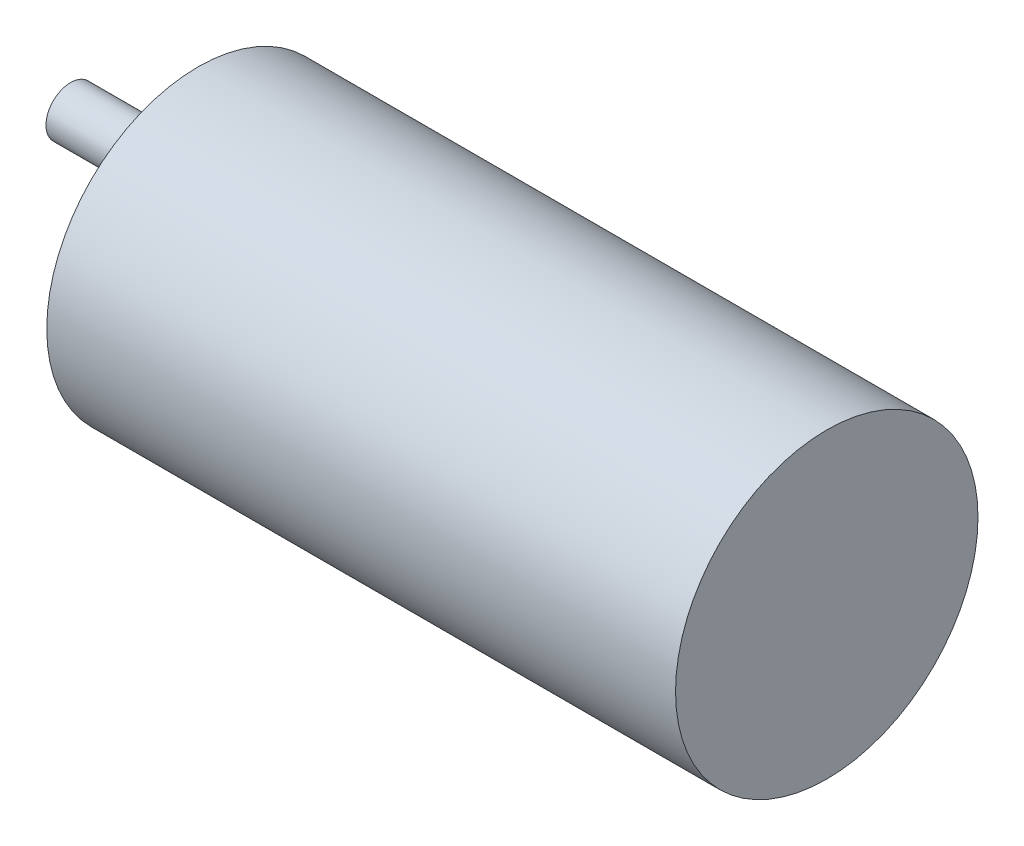
ISO-10303-21;
HEADER;
FILE_DESCRIPTION(('STEP AP214'),'2;1');
FILE_NAME('part.step','',(''),(''),'','','');
FILE_SCHEMA(('AUTOMOTIVE_DESIGN { 1 0 10303 214 1 1 1 1 }'));
ENDSEC;
DATA;
#1=APPLICATION_CONTEXT('core data for automotive mechanical design processes');
#2=APPLICATION_PROTOCOL_DEFINITION('international standard','automotive_design',2000,#1);
#3=PRODUCT_CONTEXT('',#1,'mechanical');
#4=PRODUCT('Part','Part','',(#3));
#5=PRODUCT_RELATED_PRODUCT_CATEGORY('part','',(#4));
#6=PRODUCT_DEFINITION_FORMATION('','',#4);
#7=PRODUCT_DEFINITION_CONTEXT('part definition',#1,'design');
#8=PRODUCT_DEFINITION('design','',#6,#7);
#9=PRODUCT_DEFINITION_SHAPE('','',#8);
#10=(LENGTH_UNIT() NAMED_UNIT(*) SI_UNIT(.MILLI.,.METRE.));
#11=(NAMED_UNIT(*) PLANE_ANGLE_UNIT() SI_UNIT($,.RADIAN.));
#12=(NAMED_UNIT(*) SI_UNIT($,.STERADIAN.) SOLID_ANGLE_UNIT());
#13=UNCERTAINTY_MEASURE_WITH_UNIT(LENGTH_MEASURE(1.E-05),#10,'distance_accuracy_value','');
#14=(GEOMETRIC_REPRESENTATION_CONTEXT(3) GLOBAL_UNCERTAINTY_ASSIGNED_CONTEXT((#13)) GLOBAL_UNIT_ASSIGNED_CONTEXT((#10,
#11,#12)) REPRESENTATION_CONTEXT('',''));
#15=CARTESIAN_POINT('',(0.,0.,0.));
#16=DIRECTION('',(0.,0.,1.));
#17=DIRECTION('',(1.,0.,0.));
#18=AXIS2_PLACEMENT_3D('',#15,#16,#17);
#19=CARTESIAN_POINT('',(-21.5,0.,-6.));
#20=DIRECTION('',(1.,0.,0.));
#21=DIRECTION('',(0.,0.,-1.));
#22=AXIS2_PLACEMENT_3D('',#19,#20,#21);
#23=PLANE('',#22);
#24=CARTESIAN_POINT('',(-21.5,0.,-6.));
#25=DIRECTION('',(1.,0.,0.));
#26=DIRECTION('',(0.,0.,-1.));
#27=AXIS2_PLACEMENT_3D('',#24,#25,#26);
#28=CIRCLE('',#27,3.);
#29=CARTESIAN_POINT('',(-21.5,0.,-9.));
#30=VERTEX_POINT('',#29);
#31=EDGE_CURVE('E41',#30,#30,#28,.T.);
#32=ORIENTED_EDGE('',*,*,#31,.F.);
#33=EDGE_LOOP('',(#32));
#34=FACE_BOUND('',#33,.T.);
#35=ADVANCED_FACE('F15',(#34),#23,.F.);
#36=CARTESIAN_POINT('',(-6.,0.,0.));
#37=DIRECTION('',(1.,0.,0.));
#38=DIRECTION('',(0.,0.,-1.));
#39=AXIS2_PLACEMENT_3D('',#36,#37,#38);
#40=PLANE('',#39);
#41=CARTESIAN_POINT('',(-6.,0.,-6.));
#42=DIRECTION('',(1.,0.,0.));
#43=DIRECTION('',(0.,0.,-1.));
#44=AXIS2_PLACEMENT_3D('',#41,#42,#43);
#45=CIRCLE('',#44,3.);
#46=CARTESIAN_POINT('',(-6.,0.,-9.));
#47=VERTEX_POINT('',#46);
#48=EDGE_CURVE('E38',#47,#47,#45,.T.);
#49=ORIENTED_EDGE('',*,*,#48,.T.);
#50=EDGE_LOOP('',(#49));
#51=FACE_BOUND('',#50,.T.);
#52=CARTESIAN_POINT('',(-6.,0.,-6.));
#53=DIRECTION('',(1.,0.,0.));
#54=DIRECTION('',(0.,0.,-1.));
#55=AXIS2_PLACEMENT_3D('',#52,#53,#54);
#56=CIRCLE('',#55,6.);
#57=CARTESIAN_POINT('',(-6.,0.,-12.));
#58=VERTEX_POINT('',#57);
#59=EDGE_CURVE('E34',#58,#58,#56,.T.);
#60=ORIENTED_EDGE('',*,*,#59,.F.);
#61=EDGE_LOOP('',(#60));
#62=FACE_BOUND('',#61,.T.);
#63=ADVANCED_FACE('F17',(#51,#62),#40,.F.);
#64=CARTESIAN_POINT('',(76.5,0.,18.4));
#65=DIRECTION('',(1.,0.,0.));
#66=DIRECTION('',(0.,1.,0.));
#67=AXIS2_PLACEMENT_3D('',#64,#65,#66);
#68=PLANE('',#67);
#69=CARTESIAN_POINT('',(76.5,0.,0.));
#70=DIRECTION('',(-1.,0.,0.));
#71=DIRECTION('',(0.,0.,1.));
#72=AXIS2_PLACEMENT_3D('',#69,#70,#71);
#73=CIRCLE('',#72,18.4);
#74=CARTESIAN_POINT('',(76.5,0.,18.4));
#75=VERTEX_POINT('',#74);
#76=EDGE_CURVE('E24',#75,#75,#73,.T.);
#77=ORIENTED_EDGE('',*,*,#76,.F.);
#78=EDGE_LOOP('',(#77));
#79=FACE_BOUND('',#78,.T.);
#80=ADVANCED_FACE('F53',(#79),#68,.T.);
#81=CARTESIAN_POINT('',(0.,0.,0.));
#82=DIRECTION('',(-1.,0.,0.));
#83=DIRECTION('',(0.,0.,1.));
#84=AXIS2_PLACEMENT_3D('',#81,#82,#83);
#85=PLANE('',#84);
#86=CARTESIAN_POINT('',(0.,0.,-6.));
#87=DIRECTION('',(1.,0.,0.));
#88=DIRECTION('',(0.,0.,-1.));
#89=AXIS2_PLACEMENT_3D('',#86,#87,#88);
#90=CIRCLE('',#89,6.);
#91=CARTESIAN_POINT('',(0.,0.,-12.));
#92=VERTEX_POINT('',#91);
#93=EDGE_CURVE('E19',#92,#92,#90,.T.);
#94=ORIENTED_EDGE('',*,*,#93,.T.);
#95=EDGE_LOOP('',(#94));
#96=FACE_BOUND('',#95,.T.);
#97=CARTESIAN_POINT('',(0.,0.,0.));
#98=DIRECTION('',(-1.,0.,0.));
#99=DIRECTION('',(0.,0.,1.));
#100=AXIS2_PLACEMENT_3D('',#97,#98,#99);
#101=CIRCLE('',#100,18.4);
#102=CARTESIAN_POINT('',(0.,0.,18.4));
#103=VERTEX_POINT('',#102);
#104=EDGE_CURVE('E10',#103,#103,#101,.T.);
#105=ORIENTED_EDGE('',*,*,#104,.T.);
#106=EDGE_LOOP('',(#105));
#107=FACE_BOUND('',#106,.T.);
#108=ADVANCED_FACE('F58',(#96,#107),#85,.T.);
#109=CARTESIAN_POINT('',(0.,0.,0.));
#110=DIRECTION('',(-1.,0.,0.));
#111=DIRECTION('',(0.,0.,1.));
#112=AXIS2_PLACEMENT_3D('',#109,#110,#111);
#113=CYLINDRICAL_SURFACE('',#112,18.4);
#114=ORIENTED_EDGE('',*,*,#104,.F.);
#115=EDGE_LOOP('',(#114));
#116=FACE_BOUND('',#115,.T.);
#117=ORIENTED_EDGE('',*,*,#76,.T.);
#118=EDGE_LOOP('',(#117));
#119=FACE_BOUND('',#118,.T.);
#120=ADVANCED_FACE('F62',(#116,#119),#113,.T.);
#121=CARTESIAN_POINT('',(-9.5,0.,-6.));
#122=DIRECTION('',(1.,0.,0.));
#123=DIRECTION('',(0.,0.,-1.));
#124=AXIS2_PLACEMENT_3D('',#121,#122,#123);
#125=CYLINDRICAL_SURFACE('',#124,6.);
#126=ORIENTED_EDGE('',*,*,#93,.F.);
#127=EDGE_LOOP('',(#126));
#128=FACE_BOUND('',#127,.T.);
#129=ORIENTED_EDGE('',*,*,#59,.T.);
#130=EDGE_LOOP('',(#129));
#131=FACE_BOUND('',#130,.T.);
#132=ADVANCED_FACE('F66',(#128,#131),#125,.T.);
#133=CARTESIAN_POINT('',(-9.5,0.,-6.));
#134=DIRECTION('',(1.,0.,0.));
#135=DIRECTION('',(0.,0.,-1.));
#136=AXIS2_PLACEMENT_3D('',#133,#134,#135);
#137=CYLINDRICAL_SURFACE('',#136,3.);
#138=ORIENTED_EDGE('',*,*,#48,.F.);
#139=EDGE_LOOP('',(#138));
#140=FACE_BOUND('',#139,.T.);
#141=ORIENTED_EDGE('',*,*,#31,.T.);
#142=EDGE_LOOP('',(#141));
#143=FACE_BOUND('',#142,.T.);
#144=ADVANCED_FACE('F47',(#140,#143),#137,.T.);
#145=CLOSED_SHELL('',(#35,#63,#80,#108,#120,#132,#144));
#146=MANIFOLD_SOLID_BREP('B1',#145);
#147=ADVANCED_BREP_SHAPE_REPRESENTATION('',(#18,#146),#14);
#148=SHAPE_DEFINITION_REPRESENTATION(#9,#147);
ENDSEC;
END-ISO-10303-21;
